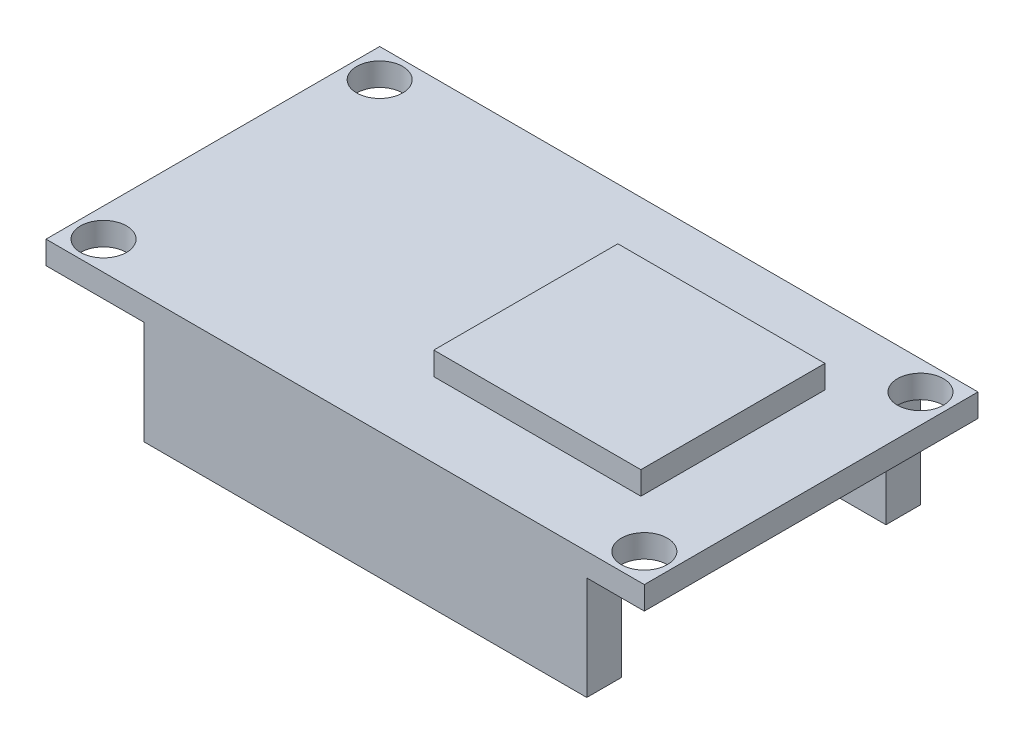
ISO-10303-21;
HEADER;
FILE_DESCRIPTION(('STEP AP214'),'2;1');
FILE_NAME('part.step','',(''),(''),'','','');
FILE_SCHEMA(('AUTOMOTIVE_DESIGN { 1 0 10303 214 1 1 1 1 }'));
ENDSEC;
DATA;
#1=APPLICATION_CONTEXT('core data for automotive mechanical design processes');
#2=APPLICATION_PROTOCOL_DEFINITION('international standard','automotive_design',2000,#1);
#3=PRODUCT_CONTEXT('',#1,'mechanical');
#4=PRODUCT('Part','Part','',(#3));
#5=PRODUCT_RELATED_PRODUCT_CATEGORY('part','',(#4));
#6=PRODUCT_DEFINITION_FORMATION('','',#4);
#7=PRODUCT_DEFINITION_CONTEXT('part definition',#1,'design');
#8=PRODUCT_DEFINITION('design','',#6,#7);
#9=PRODUCT_DEFINITION_SHAPE('','',#8);
#10=(LENGTH_UNIT() NAMED_UNIT(*) SI_UNIT(.MILLI.,.METRE.));
#11=(NAMED_UNIT(*) PLANE_ANGLE_UNIT() SI_UNIT($,.RADIAN.));
#12=(NAMED_UNIT(*) SI_UNIT($,.STERADIAN.) SOLID_ANGLE_UNIT());
#13=UNCERTAINTY_MEASURE_WITH_UNIT(LENGTH_MEASURE(1.E-05),#10,'distance_accuracy_value','');
#14=(GEOMETRIC_REPRESENTATION_CONTEXT(3) GLOBAL_UNCERTAINTY_ASSIGNED_CONTEXT((#13)) GLOBAL_UNIT_ASSIGNED_CONTEXT((#10,
#11,#12)) REPRESENTATION_CONTEXT('',''));
#15=CARTESIAN_POINT('',(0.,0.,0.));
#16=DIRECTION('',(0.,0.,1.));
#17=DIRECTION('',(1.,0.,0.));
#18=AXIS2_PLACEMENT_3D('',#15,#16,#17);
#19=CARTESIAN_POINT('',(0.,0.,0.));
#20=DIRECTION('',(0.,-1.,0.));
#21=DIRECTION('',(0.,0.,-1.));
#22=AXIS2_PLACEMENT_3D('',#19,#20,#21);
#23=PLANE('',#22);
#24=CARTESIAN_POINT('',(2.5,0.,-2.5));
#25=DIRECTION('',(0.,1.,0.));
#26=DIRECTION('',(0.,0.,1.));
#27=AXIS2_PLACEMENT_3D('',#24,#25,#26);
#28=CIRCLE('',#27,2.);
#29=CARTESIAN_POINT('',(2.5,0.,-0.499999999999999));
#30=VERTEX_POINT('',#29);
#31=EDGE_CURVE('E240',#30,#30,#28,.T.);
#32=ORIENTED_EDGE('',*,*,#31,.T.);
#33=EDGE_LOOP('',(#32));
#34=FACE_BOUND('',#33,.T.);
#35=CARTESIAN_POINT('',(49.5,0.,-26.5));
#36=DIRECTION('',(0.,1.,0.));
#37=DIRECTION('',(0.,0.,1.));
#38=AXIS2_PLACEMENT_3D('',#35,#36,#37);
#39=CIRCLE('',#38,2.);
#40=CARTESIAN_POINT('',(49.5,0.,-24.5));
#41=VERTEX_POINT('',#40);
#42=EDGE_CURVE('E252',#41,#41,#39,.T.);
#43=ORIENTED_EDGE('',*,*,#42,.T.);
#44=EDGE_LOOP('',(#43));
#45=FACE_BOUND('',#44,.T.);
#46=CARTESIAN_POINT('',(49.5,0.,-2.5));
#47=DIRECTION('',(0.,1.,0.));
#48=DIRECTION('',(0.,0.,-1.));
#49=AXIS2_PLACEMENT_3D('',#46,#47,#48);
#50=CIRCLE('',#49,2.);
#51=CARTESIAN_POINT('',(49.5,0.,-4.50000000000001));
#52=VERTEX_POINT('',#51);
#53=EDGE_CURVE('E246',#52,#52,#50,.T.);
#54=ORIENTED_EDGE('',*,*,#53,.T.);
#55=EDGE_LOOP('',(#54));
#56=FACE_BOUND('',#55,.T.);
#57=CARTESIAN_POINT('',(2.5,0.,-26.5));
#58=DIRECTION('',(0.,1.,0.));
#59=DIRECTION('',(0.,0.,-1.));
#60=AXIS2_PLACEMENT_3D('',#57,#58,#59);
#61=CIRCLE('',#60,2.);
#62=CARTESIAN_POINT('',(2.5,0.,-28.5));
#63=VERTEX_POINT('',#62);
#64=EDGE_CURVE('E236',#63,#63,#61,.T.);
#65=ORIENTED_EDGE('',*,*,#64,.T.);
#66=EDGE_LOOP('',(#65));
#67=FACE_BOUND('',#66,.T.);
#68=DIRECTION('',(-1.,0.,0.));
#69=VECTOR('',#68,1.);
#70=CARTESIAN_POINT('',(8.50000000000002,0.,-26.));
#71=LINE('',#70,#69);
#72=CARTESIAN_POINT('',(47.,0.,-26.));
#73=VERTEX_POINT('',#72);
#74=CARTESIAN_POINT('',(8.50000000000002,0.,-26.));
#75=VERTEX_POINT('',#74);
#76=EDGE_CURVE('E295',#73,#75,#71,.T.);
#77=ORIENTED_EDGE('',*,*,#76,.F.);
#78=DIRECTION('',(0.,0.,1.));
#79=VECTOR('',#78,1.);
#80=CARTESIAN_POINT('',(47.,0.,-29.));
#81=LINE('',#80,#79);
#82=CARTESIAN_POINT('',(47.,0.,-29.));
#83=VERTEX_POINT('',#82);
#84=EDGE_CURVE('E293',#83,#73,#81,.T.);
#85=ORIENTED_EDGE('',*,*,#84,.F.);
#86=DIRECTION('',(-1.,0.,0.));
#87=VECTOR('',#86,1.);
#88=CARTESIAN_POINT('',(0.,0.,-29.));
#89=LINE('',#88,#87);
#90=CARTESIAN_POINT('',(52.,0.,-29.));
#91=VERTEX_POINT('',#90);
#92=EDGE_CURVE('E170',#91,#83,#89,.T.);
#93=ORIENTED_EDGE('',*,*,#92,.F.);
#94=DIRECTION('',(0.,0.,-1.));
#95=VECTOR('',#94,1.);
#96=CARTESIAN_POINT('',(52.,0.,0.));
#97=LINE('',#96,#95);
#98=CARTESIAN_POINT('',(52.,0.,0.));
#99=VERTEX_POINT('',#98);
#100=EDGE_CURVE('E277',#99,#91,#97,.T.);
#101=ORIENTED_EDGE('',*,*,#100,.F.);
#102=DIRECTION('',(1.,0.,0.));
#103=VECTOR('',#102,1.);
#104=CARTESIAN_POINT('',(0.,0.,0.));
#105=LINE('',#104,#103);
#106=CARTESIAN_POINT('',(47.,0.,0.));
#107=VERTEX_POINT('',#106);
#108=EDGE_CURVE('E273',#107,#99,#105,.T.);
#109=ORIENTED_EDGE('',*,*,#108,.F.);
#110=DIRECTION('',(0.,0.,1.));
#111=VECTOR('',#110,1.);
#112=CARTESIAN_POINT('',(47.,0.,0.));
#113=LINE('',#112,#111);
#114=CARTESIAN_POINT('',(47.,0.,-3.));
#115=VERTEX_POINT('',#114);
#116=EDGE_CURVE('E183',#115,#107,#113,.T.);
#117=ORIENTED_EDGE('',*,*,#116,.F.);
#118=DIRECTION('',(1.,0.,0.));
#119=VECTOR('',#118,1.);
#120=CARTESIAN_POINT('',(8.49999999999999,0.,-3.));
#121=LINE('',#120,#119);
#122=CARTESIAN_POINT('',(8.49999999999999,0.,-3.));
#123=VERTEX_POINT('',#122);
#124=EDGE_CURVE('E58',#123,#115,#121,.T.);
#125=ORIENTED_EDGE('',*,*,#124,.F.);
#126=DIRECTION('',(0.,0.,-1.));
#127=VECTOR('',#126,1.);
#128=CARTESIAN_POINT('',(8.49999999999999,0.,0.));
#129=LINE('',#128,#127);
#130=CARTESIAN_POINT('',(8.49999999999999,0.,0.));
#131=VERTEX_POINT('',#130);
#132=EDGE_CURVE('E171',#131,#123,#129,.T.);
#133=ORIENTED_EDGE('',*,*,#132,.F.);
#134=CARTESIAN_POINT('',(0.,0.,0.));
#135=VERTEX_POINT('',#134);
#136=EDGE_CURVE('E274',#135,#131,#105,.T.);
#137=ORIENTED_EDGE('',*,*,#136,.F.);
#138=DIRECTION('',(0.,0.,1.));
#139=VECTOR('',#138,1.);
#140=CARTESIAN_POINT('',(0.,0.,0.));
#141=LINE('',#140,#139);
#142=CARTESIAN_POINT('',(0.,0.,-29.));
#143=VERTEX_POINT('',#142);
#144=EDGE_CURVE('E258',#143,#135,#141,.T.);
#145=ORIENTED_EDGE('',*,*,#144,.F.);
#146=CARTESIAN_POINT('',(8.50000000000002,0.,-29.));
#147=VERTEX_POINT('',#146);
#148=EDGE_CURVE('E279',#147,#143,#89,.T.);
#149=ORIENTED_EDGE('',*,*,#148,.F.);
#150=DIRECTION('',(0.,0.,-1.));
#151=VECTOR('',#150,1.);
#152=CARTESIAN_POINT('',(8.50000000000002,0.,-29.));
#153=LINE('',#152,#151);
#154=EDGE_CURVE('E164',#75,#147,#153,.T.);
#155=ORIENTED_EDGE('',*,*,#154,.F.);
#156=EDGE_LOOP('',(#77,#85,#93,#101,#109,#117,#125,#133,#137,#145,#149,#155));
#157=FACE_BOUND('',#156,.T.);
#158=ADVANCED_FACE('F35',(#34,#45,#56,#67,#157),#23,.T.);
#159=CARTESIAN_POINT('',(0.,2.,0.));
#160=DIRECTION('',(0.,-1.,0.));
#161=DIRECTION('',(0.,0.,-1.));
#162=AXIS2_PLACEMENT_3D('',#159,#160,#161);
#163=PLANE('',#162);
#164=CARTESIAN_POINT('',(2.5,2.,-26.5));
#165=DIRECTION('',(0.,1.,0.));
#166=DIRECTION('',(0.,0.,-1.));
#167=AXIS2_PLACEMENT_3D('',#164,#165,#166);
#168=CIRCLE('',#167,2.);
#169=CARTESIAN_POINT('',(2.5,2.,-28.5));
#170=VERTEX_POINT('',#169);
#171=EDGE_CURVE('E237',#170,#170,#168,.T.);
#172=ORIENTED_EDGE('',*,*,#171,.F.);
#173=EDGE_LOOP('',(#172));
#174=FACE_BOUND('',#173,.T.);
#175=CARTESIAN_POINT('',(2.5,2.,-2.5));
#176=DIRECTION('',(0.,1.,0.));
#177=DIRECTION('',(0.,0.,1.));
#178=AXIS2_PLACEMENT_3D('',#175,#176,#177);
#179=CIRCLE('',#178,2.);
#180=CARTESIAN_POINT('',(2.5,2.,-0.499999999999999));
#181=VERTEX_POINT('',#180);
#182=EDGE_CURVE('E243',#181,#181,#179,.T.);
#183=ORIENTED_EDGE('',*,*,#182,.F.);
#184=EDGE_LOOP('',(#183));
#185=FACE_BOUND('',#184,.T.);
#186=CARTESIAN_POINT('',(49.5,2.,-2.5));
#187=DIRECTION('',(0.,1.,0.));
#188=DIRECTION('',(0.,0.,-1.));
#189=AXIS2_PLACEMENT_3D('',#186,#187,#188);
#190=CIRCLE('',#189,2.);
#191=CARTESIAN_POINT('',(49.5,2.,-4.50000000000001));
#192=VERTEX_POINT('',#191);
#193=EDGE_CURVE('E249',#192,#192,#190,.T.);
#194=ORIENTED_EDGE('',*,*,#193,.F.);
#195=EDGE_LOOP('',(#194));
#196=FACE_BOUND('',#195,.T.);
#197=CARTESIAN_POINT('',(49.5,2.,-26.5));
#198=DIRECTION('',(0.,1.,0.));
#199=DIRECTION('',(0.,0.,1.));
#200=AXIS2_PLACEMENT_3D('',#197,#198,#199);
#201=CIRCLE('',#200,2.);
#202=CARTESIAN_POINT('',(49.5,2.,-24.5));
#203=VERTEX_POINT('',#202);
#204=EDGE_CURVE('E255',#203,#203,#201,.T.);
#205=ORIENTED_EDGE('',*,*,#204,.F.);
#206=EDGE_LOOP('',(#205));
#207=FACE_BOUND('',#206,.T.);
#208=DIRECTION('',(0.,0.,1.));
#209=VECTOR('',#208,1.);
#210=CARTESIAN_POINT('',(0.,2.,0.));
#211=LINE('',#210,#209);
#212=CARTESIAN_POINT('',(0.,2.,-29.));
#213=VERTEX_POINT('',#212);
#214=CARTESIAN_POINT('',(0.,2.,0.));
#215=VERTEX_POINT('',#214);
#216=EDGE_CURVE('E261',#213,#215,#211,.T.);
#217=ORIENTED_EDGE('',*,*,#216,.T.);
#218=DIRECTION('',(1.,0.,0.));
#219=VECTOR('',#218,1.);
#220=CARTESIAN_POINT('',(0.,2.,0.));
#221=LINE('',#220,#219);
#222=CARTESIAN_POINT('',(52.,2.,0.));
#223=VERTEX_POINT('',#222);
#224=EDGE_CURVE('E264',#215,#223,#221,.T.);
#225=ORIENTED_EDGE('',*,*,#224,.T.);
#226=DIRECTION('',(0.,0.,-1.));
#227=VECTOR('',#226,1.);
#228=CARTESIAN_POINT('',(52.,2.,0.));
#229=LINE('',#228,#227);
#230=CARTESIAN_POINT('',(52.,2.,-29.));
#231=VERTEX_POINT('',#230);
#232=EDGE_CURVE('E266',#223,#231,#229,.T.);
#233=ORIENTED_EDGE('',*,*,#232,.T.);
#234=DIRECTION('',(-1.,0.,0.));
#235=VECTOR('',#234,1.);
#236=CARTESIAN_POINT('',(0.,2.,-29.));
#237=LINE('',#236,#235);
#238=EDGE_CURVE('E268',#231,#213,#237,.T.);
#239=ORIENTED_EDGE('',*,*,#238,.T.);
#240=EDGE_LOOP('',(#217,#225,#233,#239));
#241=FACE_BOUND('',#240,.T.);
#242=DIRECTION('',(-1.,0.,0.));
#243=VECTOR('',#242,1.);
#244=CARTESIAN_POINT('',(45.2,2.,-22.5));
#245=LINE('',#244,#243);
#246=CARTESIAN_POINT('',(45.2,2.,-22.5));
#247=VERTEX_POINT('',#246);
#248=CARTESIAN_POINT('',(27.2,2.,-22.5));
#249=VERTEX_POINT('',#248);
#250=EDGE_CURVE('E203',#247,#249,#245,.T.);
#251=ORIENTED_EDGE('',*,*,#250,.F.);
#252=DIRECTION('',(0.,0.,-1.));
#253=VECTOR('',#252,1.);
#254=CARTESIAN_POINT('',(45.2,2.,-6.5));
#255=LINE('',#254,#253);
#256=CARTESIAN_POINT('',(45.2,2.,-6.5));
#257=VERTEX_POINT('',#256);
#258=EDGE_CURVE('E208',#257,#247,#255,.T.);
#259=ORIENTED_EDGE('',*,*,#258,.F.);
#260=DIRECTION('',(1.,0.,0.));
#261=VECTOR('',#260,1.);
#262=CARTESIAN_POINT('',(45.2,2.,-6.5));
#263=LINE('',#262,#261);
#264=CARTESIAN_POINT('',(27.2,2.,-6.5));
#265=VERTEX_POINT('',#264);
#266=EDGE_CURVE('E220',#265,#257,#263,.T.);
#267=ORIENTED_EDGE('',*,*,#266,.F.);
#268=DIRECTION('',(0.,0.,1.));
#269=VECTOR('',#268,1.);
#270=CARTESIAN_POINT('',(27.2,2.,-22.5));
#271=LINE('',#270,#269);
#272=EDGE_CURVE('E217',#249,#265,#271,.T.);
#273=ORIENTED_EDGE('',*,*,#272,.F.);
#274=EDGE_LOOP('',(#251,#259,#267,#273));
#275=FACE_BOUND('',#274,.T.);
#276=ADVANCED_FACE('F315',(#174,#185,#196,#207,#241,#275),#163,.F.);
#277=CARTESIAN_POINT('',(0.,2.,0.));
#278=DIRECTION('',(1.,0.,0.));
#279=DIRECTION('',(0.,0.,-1.));
#280=AXIS2_PLACEMENT_3D('',#277,#278,#279);
#281=PLANE('',#280);
#282=ORIENTED_EDGE('',*,*,#144,.T.);
#283=DIRECTION('',(0.,-1.,0.));
#284=VECTOR('',#283,1.);
#285=CARTESIAN_POINT('',(0.,2.,0.));
#286=LINE('',#285,#284);
#287=EDGE_CURVE('E11',#215,#135,#286,.T.);
#288=ORIENTED_EDGE('',*,*,#287,.F.);
#289=ORIENTED_EDGE('',*,*,#216,.F.);
#290=DIRECTION('',(0.,-1.,0.));
#291=VECTOR('',#290,1.);
#292=CARTESIAN_POINT('',(0.,2.,-29.));
#293=LINE('',#292,#291);
#294=EDGE_CURVE('E270',#213,#143,#293,.T.);
#295=ORIENTED_EDGE('',*,*,#294,.T.);
#296=EDGE_LOOP('',(#282,#288,#289,#295));
#297=FACE_BOUND('',#296,.T.);
#298=ADVANCED_FACE('F37',(#297),#281,.F.);
#299=CARTESIAN_POINT('',(0.,2.,0.));
#300=DIRECTION('',(0.,0.,-1.));
#301=DIRECTION('',(-1.,0.,0.));
#302=AXIS2_PLACEMENT_3D('',#299,#300,#301);
#303=PLANE('',#302);
#304=ORIENTED_EDGE('',*,*,#136,.T.);
#305=DIRECTION('',(0.,1.,0.));
#306=VECTOR('',#305,1.);
#307=CARTESIAN_POINT('',(8.49999999999999,-9.,0.));
#308=LINE('',#307,#306);
#309=CARTESIAN_POINT('',(8.49999999999999,-9.,0.));
#310=VERTEX_POINT('',#309);
#311=EDGE_CURVE('E188',#310,#131,#308,.T.);
#312=ORIENTED_EDGE('',*,*,#311,.F.);
#313=DIRECTION('',(-1.,0.,0.));
#314=VECTOR('',#313,1.);
#315=CARTESIAN_POINT('',(8.49999999999999,-9.,0.));
#316=LINE('',#315,#314);
#317=CARTESIAN_POINT('',(47.,-9.,0.));
#318=VERTEX_POINT('',#317);
#319=EDGE_CURVE('E187',#318,#310,#316,.T.);
#320=ORIENTED_EDGE('',*,*,#319,.F.);
#321=DIRECTION('',(0.,1.,0.));
#322=VECTOR('',#321,1.);
#323=CARTESIAN_POINT('',(47.,-9.,0.));
#324=LINE('',#323,#322);
#325=EDGE_CURVE('E195',#318,#107,#324,.T.);
#326=ORIENTED_EDGE('',*,*,#325,.T.);
#327=ORIENTED_EDGE('',*,*,#108,.T.);
#328=DIRECTION('',(0.,-1.,0.));
#329=VECTOR('',#328,1.);
#330=CARTESIAN_POINT('',(52.,2.,0.));
#331=LINE('',#330,#329);
#332=EDGE_CURVE('E43',#223,#99,#331,.T.);
#333=ORIENTED_EDGE('',*,*,#332,.F.);
#334=ORIENTED_EDGE('',*,*,#224,.F.);
#335=ORIENTED_EDGE('',*,*,#287,.T.);
#336=EDGE_LOOP('',(#304,#312,#320,#326,#327,#333,#334,#335));
#337=FACE_BOUND('',#336,.T.);
#338=ADVANCED_FACE('F317',(#337),#303,.F.);
#339=CARTESIAN_POINT('',(52.,2.,0.));
#340=DIRECTION('',(-1.,0.,0.));
#341=DIRECTION('',(0.,0.,1.));
#342=AXIS2_PLACEMENT_3D('',#339,#340,#341);
#343=PLANE('',#342);
#344=ORIENTED_EDGE('',*,*,#100,.T.);
#345=DIRECTION('',(0.,-1.,0.));
#346=VECTOR('',#345,1.);
#347=CARTESIAN_POINT('',(52.,2.,-29.));
#348=LINE('',#347,#346);
#349=EDGE_CURVE('E283',#231,#91,#348,.T.);
#350=ORIENTED_EDGE('',*,*,#349,.F.);
#351=ORIENTED_EDGE('',*,*,#232,.F.);
#352=ORIENTED_EDGE('',*,*,#332,.T.);
#353=EDGE_LOOP('',(#344,#350,#351,#352));
#354=FACE_BOUND('',#353,.T.);
#355=ADVANCED_FACE('F289',(#354),#343,.F.);
#356=CARTESIAN_POINT('',(0.,2.,-29.));
#357=DIRECTION('',(0.,0.,1.));
#358=DIRECTION('',(1.,0.,0.));
#359=AXIS2_PLACEMENT_3D('',#356,#357,#358);
#360=PLANE('',#359);
#361=ORIENTED_EDGE('',*,*,#92,.T.);
#362=DIRECTION('',(0.,1.,0.));
#363=VECTOR('',#362,1.);
#364=CARTESIAN_POINT('',(47.,-9.,-29.));
#365=LINE('',#364,#363);
#366=CARTESIAN_POINT('',(47.,-9.,-29.));
#367=VERTEX_POINT('',#366);
#368=EDGE_CURVE('E152',#367,#83,#365,.T.);
#369=ORIENTED_EDGE('',*,*,#368,.F.);
#370=DIRECTION('',(1.,0.,0.));
#371=VECTOR('',#370,1.);
#372=CARTESIAN_POINT('',(8.50000000000002,-9.,-29.));
#373=LINE('',#372,#371);
#374=CARTESIAN_POINT('',(8.50000000000002,-9.,-29.));
#375=VERTEX_POINT('',#374);
#376=EDGE_CURVE('E159',#375,#367,#373,.T.);
#377=ORIENTED_EDGE('',*,*,#376,.F.);
#378=DIRECTION('',(0.,1.,0.));
#379=VECTOR('',#378,1.);
#380=CARTESIAN_POINT('',(8.50000000000002,-9.,-29.));
#381=LINE('',#380,#379);
#382=EDGE_CURVE('E50',#375,#147,#381,.T.);
#383=ORIENTED_EDGE('',*,*,#382,.T.);
#384=ORIENTED_EDGE('',*,*,#148,.T.);
#385=ORIENTED_EDGE('',*,*,#294,.F.);
#386=ORIENTED_EDGE('',*,*,#238,.F.);
#387=ORIENTED_EDGE('',*,*,#349,.T.);
#388=EDGE_LOOP('',(#361,#369,#377,#383,#384,#385,#386,#387));
#389=FACE_BOUND('',#388,.T.);
#390=ADVANCED_FACE('F167',(#389),#360,.F.);
#391=CARTESIAN_POINT('',(49.5,2.,-26.5));
#392=DIRECTION('',(0.,-1.,0.));
#393=DIRECTION('',(0.,0.,-1.));
#394=AXIS2_PLACEMENT_3D('',#391,#392,#393);
#395=CYLINDRICAL_SURFACE('',#394,2.);
#396=ORIENTED_EDGE('',*,*,#204,.T.);
#397=EDGE_LOOP('',(#396));
#398=FACE_BOUND('',#397,.T.);
#399=ORIENTED_EDGE('',*,*,#42,.F.);
#400=EDGE_LOOP('',(#399));
#401=FACE_BOUND('',#400,.T.);
#402=ADVANCED_FACE('F355',(#398,#401),#395,.F.);
#403=CARTESIAN_POINT('',(49.5,2.,-2.5));
#404=DIRECTION('',(0.,-1.,0.));
#405=DIRECTION('',(0.,0.,-1.));
#406=AXIS2_PLACEMENT_3D('',#403,#404,#405);
#407=CYLINDRICAL_SURFACE('',#406,2.);
#408=ORIENTED_EDGE('',*,*,#193,.T.);
#409=EDGE_LOOP('',(#408));
#410=FACE_BOUND('',#409,.T.);
#411=ORIENTED_EDGE('',*,*,#53,.F.);
#412=EDGE_LOOP('',(#411));
#413=FACE_BOUND('',#412,.T.);
#414=ADVANCED_FACE('F505',(#410,#413),#407,.F.);
#415=CARTESIAN_POINT('',(2.5,2.,-2.5));
#416=DIRECTION('',(0.,-1.,0.));
#417=DIRECTION('',(0.,0.,-1.));
#418=AXIS2_PLACEMENT_3D('',#415,#416,#417);
#419=CYLINDRICAL_SURFACE('',#418,2.);
#420=ORIENTED_EDGE('',*,*,#182,.T.);
#421=EDGE_LOOP('',(#420));
#422=FACE_BOUND('',#421,.T.);
#423=ORIENTED_EDGE('',*,*,#31,.F.);
#424=EDGE_LOOP('',(#423));
#425=FACE_BOUND('',#424,.T.);
#426=ADVANCED_FACE('F512',(#422,#425),#419,.F.);
#427=CARTESIAN_POINT('',(2.5,2.,-26.5));
#428=DIRECTION('',(0.,-1.,0.));
#429=DIRECTION('',(0.,0.,-1.));
#430=AXIS2_PLACEMENT_3D('',#427,#428,#429);
#431=CYLINDRICAL_SURFACE('',#430,2.);
#432=ORIENTED_EDGE('',*,*,#171,.T.);
#433=EDGE_LOOP('',(#432));
#434=FACE_BOUND('',#433,.T.);
#435=ORIENTED_EDGE('',*,*,#64,.F.);
#436=EDGE_LOOP('',(#435));
#437=FACE_BOUND('',#436,.T.);
#438=ADVANCED_FACE('F376',(#434,#437),#431,.F.);
#439=CARTESIAN_POINT('',(45.2,4.,-22.5));
#440=DIRECTION('',(0.,0.,1.));
#441=DIRECTION('',(1.,0.,0.));
#442=AXIS2_PLACEMENT_3D('',#439,#440,#441);
#443=PLANE('',#442);
#444=ORIENTED_EDGE('',*,*,#250,.T.);
#445=DIRECTION('',(0.,-1.,0.));
#446=VECTOR('',#445,1.);
#447=CARTESIAN_POINT('',(27.2,4.,-22.5));
#448=LINE('',#447,#446);
#449=CARTESIAN_POINT('',(27.2,4.,-22.5));
#450=VERTEX_POINT('',#449);
#451=EDGE_CURVE('E233',#450,#249,#448,.T.);
#452=ORIENTED_EDGE('',*,*,#451,.F.);
#453=DIRECTION('',(-1.,0.,0.));
#454=VECTOR('',#453,1.);
#455=CARTESIAN_POINT('',(45.2,4.,-22.5));
#456=LINE('',#455,#454);
#457=CARTESIAN_POINT('',(45.2,4.,-22.5));
#458=VERTEX_POINT('',#457);
#459=EDGE_CURVE('E204',#458,#450,#456,.T.);
#460=ORIENTED_EDGE('',*,*,#459,.F.);
#461=DIRECTION('',(0.,-1.,0.));
#462=VECTOR('',#461,1.);
#463=CARTESIAN_POINT('',(45.2,4.,-22.5));
#464=LINE('',#463,#462);
#465=EDGE_CURVE('E214',#458,#247,#464,.T.);
#466=ORIENTED_EDGE('',*,*,#465,.T.);
#467=EDGE_LOOP('',(#444,#452,#460,#466));
#468=FACE_BOUND('',#467,.T.);
#469=ADVANCED_FACE('F380',(#468),#443,.F.);
#470=CARTESIAN_POINT('',(27.2,4.,-22.5));
#471=DIRECTION('',(1.,0.,0.));
#472=DIRECTION('',(0.,0.,-1.));
#473=AXIS2_PLACEMENT_3D('',#470,#471,#472);
#474=PLANE('',#473);
#475=ORIENTED_EDGE('',*,*,#272,.T.);
#476=DIRECTION('',(0.,-1.,0.));
#477=VECTOR('',#476,1.);
#478=CARTESIAN_POINT('',(27.2,4.,-6.5));
#479=LINE('',#478,#477);
#480=CARTESIAN_POINT('',(27.2,4.,-6.5));
#481=VERTEX_POINT('',#480);
#482=EDGE_CURVE('E230',#481,#265,#479,.T.);
#483=ORIENTED_EDGE('',*,*,#482,.F.);
#484=DIRECTION('',(0.,0.,1.));
#485=VECTOR('',#484,1.);
#486=CARTESIAN_POINT('',(27.2,4.,-22.5));
#487=LINE('',#486,#485);
#488=EDGE_CURVE('E207',#450,#481,#487,.T.);
#489=ORIENTED_EDGE('',*,*,#488,.F.);
#490=ORIENTED_EDGE('',*,*,#451,.T.);
#491=EDGE_LOOP('',(#475,#483,#489,#490));
#492=FACE_BOUND('',#491,.T.);
#493=ADVANCED_FACE('F384',(#492),#474,.F.);
#494=CARTESIAN_POINT('',(45.2,4.,-6.5));
#495=DIRECTION('',(0.,0.,-1.));
#496=DIRECTION('',(-1.,0.,0.));
#497=AXIS2_PLACEMENT_3D('',#494,#495,#496);
#498=PLANE('',#497);
#499=ORIENTED_EDGE('',*,*,#266,.T.);
#500=DIRECTION('',(0.,-1.,0.));
#501=VECTOR('',#500,1.);
#502=CARTESIAN_POINT('',(45.2,4.,-6.5));
#503=LINE('',#502,#501);
#504=CARTESIAN_POINT('',(45.2,4.,-6.5));
#505=VERTEX_POINT('',#504);
#506=EDGE_CURVE('E227',#505,#257,#503,.T.);
#507=ORIENTED_EDGE('',*,*,#506,.F.);
#508=DIRECTION('',(1.,0.,0.));
#509=VECTOR('',#508,1.);
#510=CARTESIAN_POINT('',(45.2,4.,-6.5));
#511=LINE('',#510,#509);
#512=EDGE_CURVE('E210',#481,#505,#511,.T.);
#513=ORIENTED_EDGE('',*,*,#512,.F.);
#514=ORIENTED_EDGE('',*,*,#482,.T.);
#515=EDGE_LOOP('',(#499,#507,#513,#514));
#516=FACE_BOUND('',#515,.T.);
#517=ADVANCED_FACE('F394',(#516),#498,.F.);
#518=CARTESIAN_POINT('',(45.2,4.,-6.5));
#519=DIRECTION('',(-1.,0.,0.));
#520=DIRECTION('',(0.,0.,1.));
#521=AXIS2_PLACEMENT_3D('',#518,#519,#520);
#522=PLANE('',#521);
#523=ORIENTED_EDGE('',*,*,#258,.T.);
#524=ORIENTED_EDGE('',*,*,#465,.F.);
#525=DIRECTION('',(0.,0.,-1.));
#526=VECTOR('',#525,1.);
#527=CARTESIAN_POINT('',(45.2,4.,-6.5));
#528=LINE('',#527,#526);
#529=EDGE_CURVE('E212',#505,#458,#528,.T.);
#530=ORIENTED_EDGE('',*,*,#529,.F.);
#531=ORIENTED_EDGE('',*,*,#506,.T.);
#532=EDGE_LOOP('',(#523,#524,#530,#531));
#533=FACE_BOUND('',#532,.T.);
#534=ADVANCED_FACE('F404',(#533),#522,.F.);
#535=CARTESIAN_POINT('',(0.,4.,0.));
#536=DIRECTION('',(0.,1.,0.));
#537=DIRECTION('',(0.,0.,1.));
#538=AXIS2_PLACEMENT_3D('',#535,#536,#537);
#539=PLANE('',#538);
#540=ORIENTED_EDGE('',*,*,#459,.T.);
#541=ORIENTED_EDGE('',*,*,#488,.T.);
#542=ORIENTED_EDGE('',*,*,#512,.T.);
#543=ORIENTED_EDGE('',*,*,#529,.T.);
#544=EDGE_LOOP('',(#540,#541,#542,#543));
#545=FACE_BOUND('',#544,.T.);
#546=ADVANCED_FACE('F340',(#545),#539,.T.);
#547=CARTESIAN_POINT('',(8.49999999999999,-9.,0.));
#548=DIRECTION('',(1.,0.,0.));
#549=DIRECTION('',(0.,0.,-1.));
#550=AXIS2_PLACEMENT_3D('',#547,#548,#549);
#551=PLANE('',#550);
#552=ORIENTED_EDGE('',*,*,#132,.T.);
#553=DIRECTION('',(0.,1.,0.));
#554=VECTOR('',#553,1.);
#555=CARTESIAN_POINT('',(8.49999999999999,-9.,-3.));
#556=LINE('',#555,#554);
#557=CARTESIAN_POINT('',(8.49999999999999,-9.,-3.));
#558=VERTEX_POINT('',#557);
#559=EDGE_CURVE('E201',#558,#123,#556,.T.);
#560=ORIENTED_EDGE('',*,*,#559,.F.);
#561=DIRECTION('',(0.,0.,-1.));
#562=VECTOR('',#561,1.);
#563=CARTESIAN_POINT('',(8.49999999999999,-9.,0.));
#564=LINE('',#563,#562);
#565=EDGE_CURVE('E179',#310,#558,#564,.T.);
#566=ORIENTED_EDGE('',*,*,#565,.F.);
#567=ORIENTED_EDGE('',*,*,#311,.T.);
#568=EDGE_LOOP('',(#552,#560,#566,#567));
#569=FACE_BOUND('',#568,.T.);
#570=ADVANCED_FACE('F322',(#569),#551,.F.);
#571=CARTESIAN_POINT('',(8.49999999999999,-9.,-3.));
#572=DIRECTION('',(0.,0.,1.));
#573=DIRECTION('',(1.,0.,0.));
#574=AXIS2_PLACEMENT_3D('',#571,#572,#573);
#575=PLANE('',#574);
#576=ORIENTED_EDGE('',*,*,#124,.T.);
#577=DIRECTION('',(0.,1.,0.));
#578=VECTOR('',#577,1.);
#579=CARTESIAN_POINT('',(47.,-9.,-3.));
#580=LINE('',#579,#578);
#581=CARTESIAN_POINT('',(47.,-9.,-3.));
#582=VERTEX_POINT('',#581);
#583=EDGE_CURVE('E198',#582,#115,#580,.T.);
#584=ORIENTED_EDGE('',*,*,#583,.F.);
#585=DIRECTION('',(1.,0.,0.));
#586=VECTOR('',#585,1.);
#587=CARTESIAN_POINT('',(8.49999999999999,-9.,-3.));
#588=LINE('',#587,#586);
#589=EDGE_CURVE('E182',#558,#582,#588,.T.);
#590=ORIENTED_EDGE('',*,*,#589,.F.);
#591=ORIENTED_EDGE('',*,*,#559,.T.);
#592=EDGE_LOOP('',(#576,#584,#590,#591));
#593=FACE_BOUND('',#592,.T.);
#594=ADVANCED_FACE('F332',(#593),#575,.F.);
#595=CARTESIAN_POINT('',(47.,-9.,0.));
#596=DIRECTION('',(-1.,0.,0.));
#597=DIRECTION('',(0.,0.,1.));
#598=AXIS2_PLACEMENT_3D('',#595,#596,#597);
#599=PLANE('',#598);
#600=ORIENTED_EDGE('',*,*,#116,.T.);
#601=ORIENTED_EDGE('',*,*,#325,.F.);
#602=DIRECTION('',(0.,0.,1.));
#603=VECTOR('',#602,1.);
#604=CARTESIAN_POINT('',(47.,-9.,0.));
#605=LINE('',#604,#603);
#606=EDGE_CURVE('E185',#582,#318,#605,.T.);
#607=ORIENTED_EDGE('',*,*,#606,.F.);
#608=ORIENTED_EDGE('',*,*,#583,.T.);
#609=EDGE_LOOP('',(#600,#601,#607,#608));
#610=FACE_BOUND('',#609,.T.);
#611=ADVANCED_FACE('F330',(#610),#599,.F.);
#612=CARTESIAN_POINT('',(0.,-9.,0.));
#613=DIRECTION('',(0.,-1.,0.));
#614=DIRECTION('',(0.,0.,-1.));
#615=AXIS2_PLACEMENT_3D('',#612,#613,#614);
#616=PLANE('',#615);
#617=ORIENTED_EDGE('',*,*,#565,.T.);
#618=ORIENTED_EDGE('',*,*,#589,.T.);
#619=ORIENTED_EDGE('',*,*,#606,.T.);
#620=ORIENTED_EDGE('',*,*,#319,.T.);
#621=EDGE_LOOP('',(#617,#618,#619,#620));
#622=FACE_BOUND('',#621,.T.);
#623=ADVANCED_FACE('F325',(#622),#616,.T.);
#624=CARTESIAN_POINT('',(47.,-9.,-29.));
#625=DIRECTION('',(-1.,0.,0.));
#626=DIRECTION('',(0.,0.,1.));
#627=AXIS2_PLACEMENT_3D('',#624,#625,#626);
#628=PLANE('',#627);
#629=ORIENTED_EDGE('',*,*,#84,.T.);
#630=DIRECTION('',(0.,1.,0.));
#631=VECTOR('',#630,1.);
#632=CARTESIAN_POINT('',(47.,-9.,-26.));
#633=LINE('',#632,#631);
#634=CARTESIAN_POINT('',(47.,-9.,-26.));
#635=VERTEX_POINT('',#634);
#636=EDGE_CURVE('E155',#635,#73,#633,.T.);
#637=ORIENTED_EDGE('',*,*,#636,.F.);
#638=DIRECTION('',(0.,0.,1.));
#639=VECTOR('',#638,1.);
#640=CARTESIAN_POINT('',(47.,-9.,-29.));
#641=LINE('',#640,#639);
#642=EDGE_CURVE('E148',#367,#635,#641,.T.);
#643=ORIENTED_EDGE('',*,*,#642,.F.);
#644=ORIENTED_EDGE('',*,*,#368,.T.);
#645=EDGE_LOOP('',(#629,#637,#643,#644));
#646=FACE_BOUND('',#645,.T.);
#647=ADVANCED_FACE('F150',(#646),#628,.F.);
#648=CARTESIAN_POINT('',(8.50000000000002,-9.,-26.));
#649=DIRECTION('',(0.,0.,-1.));
#650=DIRECTION('',(-1.,0.,0.));
#651=AXIS2_PLACEMENT_3D('',#648,#649,#650);
#652=PLANE('',#651);
#653=ORIENTED_EDGE('',*,*,#76,.T.);
#654=DIRECTION('',(0.,1.,0.));
#655=VECTOR('',#654,1.);
#656=CARTESIAN_POINT('',(8.50000000000002,-9.,-26.));
#657=LINE('',#656,#655);
#658=CARTESIAN_POINT('',(8.50000000000002,-9.,-26.));
#659=VERTEX_POINT('',#658);
#660=EDGE_CURVE('E175',#659,#75,#657,.T.);
#661=ORIENTED_EDGE('',*,*,#660,.F.);
#662=DIRECTION('',(-1.,0.,0.));
#663=VECTOR('',#662,1.);
#664=CARTESIAN_POINT('',(8.50000000000002,-9.,-26.));
#665=LINE('',#664,#663);
#666=EDGE_CURVE('E158',#635,#659,#665,.T.);
#667=ORIENTED_EDGE('',*,*,#666,.F.);
#668=ORIENTED_EDGE('',*,*,#636,.T.);
#669=EDGE_LOOP('',(#653,#661,#667,#668));
#670=FACE_BOUND('',#669,.T.);
#671=ADVANCED_FACE('F473',(#670),#652,.F.);
#672=CARTESIAN_POINT('',(8.50000000000002,-9.,-29.));
#673=DIRECTION('',(1.,0.,0.));
#674=DIRECTION('',(0.,0.,-1.));
#675=AXIS2_PLACEMENT_3D('',#672,#673,#674);
#676=PLANE('',#675);
#677=ORIENTED_EDGE('',*,*,#154,.T.);
#678=ORIENTED_EDGE('',*,*,#382,.F.);
#679=DIRECTION('',(0.,0.,-1.));
#680=VECTOR('',#679,1.);
#681=CARTESIAN_POINT('',(8.50000000000002,-9.,-29.));
#682=LINE('',#681,#680);
#683=EDGE_CURVE('E163',#659,#375,#682,.T.);
#684=ORIENTED_EDGE('',*,*,#683,.F.);
#685=ORIENTED_EDGE('',*,*,#660,.T.);
#686=EDGE_LOOP('',(#677,#678,#684,#685));
#687=FACE_BOUND('',#686,.T.);
#688=ADVANCED_FACE('F305',(#687),#676,.F.);
#689=CARTESIAN_POINT('',(0.,-9.,0.));
#690=DIRECTION('',(0.,-1.,0.));
#691=DIRECTION('',(0.,0.,-1.));
#692=AXIS2_PLACEMENT_3D('',#689,#690,#691);
#693=PLANE('',#692);
#694=ORIENTED_EDGE('',*,*,#376,.T.);
#695=ORIENTED_EDGE('',*,*,#642,.T.);
#696=ORIENTED_EDGE('',*,*,#666,.T.);
#697=ORIENTED_EDGE('',*,*,#683,.T.);
#698=EDGE_LOOP('',(#694,#695,#696,#697));
#699=FACE_BOUND('',#698,.T.);
#700=ADVANCED_FACE('F161',(#699),#693,.T.);
#701=CLOSED_SHELL('',(#158,#276,#298,#338,#355,#390,#402,#414,#426,#438,#469,#493,#517,#534,
#546,#570,#594,#611,#623,#647,#671,#688,#700));
#702=MANIFOLD_SOLID_BREP('B2',#701);
#703=ADVANCED_BREP_SHAPE_REPRESENTATION('',(#18,#702),#14);
#704=SHAPE_DEFINITION_REPRESENTATION(#9,#703);
ENDSEC;
END-ISO-10303-21;
